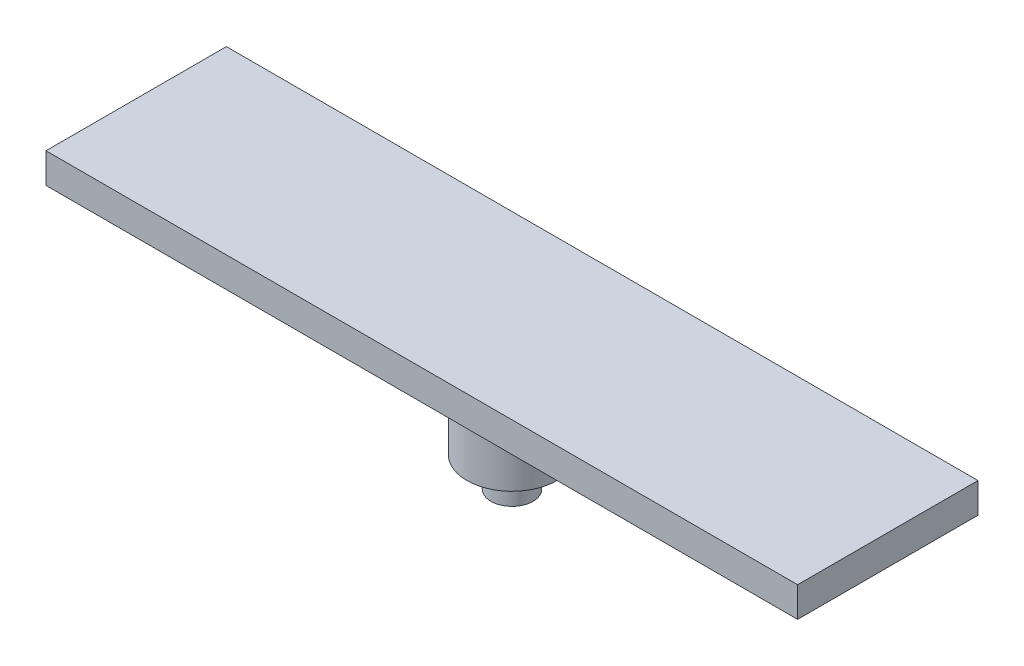
ISO-10303-21;
HEADER;
FILE_DESCRIPTION(('STEP AP214'),'2;1');
FILE_NAME('part.step','',(''),(''),'','','');
FILE_SCHEMA(('AUTOMOTIVE_DESIGN { 1 0 10303 214 1 1 1 1 }'));
ENDSEC;
DATA;
#1=APPLICATION_CONTEXT('core data for automotive mechanical design processes');
#2=APPLICATION_PROTOCOL_DEFINITION('international standard','automotive_design',2000,#1);
#3=PRODUCT_CONTEXT('',#1,'mechanical');
#4=PRODUCT('Part','Part','',(#3));
#5=PRODUCT_RELATED_PRODUCT_CATEGORY('part','',(#4));
#6=PRODUCT_DEFINITION_FORMATION('','',#4);
#7=PRODUCT_DEFINITION_CONTEXT('part definition',#1,'design');
#8=PRODUCT_DEFINITION('design','',#6,#7);
#9=PRODUCT_DEFINITION_SHAPE('','',#8);
#10=(LENGTH_UNIT() NAMED_UNIT(*) SI_UNIT(.MILLI.,.METRE.));
#11=(NAMED_UNIT(*) PLANE_ANGLE_UNIT() SI_UNIT($,.RADIAN.));
#12=(NAMED_UNIT(*) SI_UNIT($,.STERADIAN.) SOLID_ANGLE_UNIT());
#13=UNCERTAINTY_MEASURE_WITH_UNIT(LENGTH_MEASURE(1.E-05),#10,'distance_accuracy_value','');
#14=(GEOMETRIC_REPRESENTATION_CONTEXT(3) GLOBAL_UNCERTAINTY_ASSIGNED_CONTEXT((#13)) GLOBAL_UNIT_ASSIGNED_CONTEXT((#10,
#11,#12)) REPRESENTATION_CONTEXT('',''));
#15=CARTESIAN_POINT('',(0.,0.,0.));
#16=DIRECTION('',(0.,0.,1.));
#17=DIRECTION('',(1.,0.,0.));
#18=AXIS2_PLACEMENT_3D('',#15,#16,#17);
#19=CARTESIAN_POINT('',(0.,15.,0.));
#20=DIRECTION('',(0.,-1.,0.));
#21=DIRECTION('',(0.,0.,-1.));
#22=AXIS2_PLACEMENT_3D('',#19,#20,#21);
#23=CYLINDRICAL_SURFACE('',#22,7.5);
#24=CARTESIAN_POINT('',(0.,15.,0.));
#25=DIRECTION('',(0.,1.,0.));
#26=DIRECTION('',(0.,0.,1.));
#27=AXIS2_PLACEMENT_3D('',#24,#25,#26);
#28=CIRCLE('',#27,7.5);
#29=CARTESIAN_POINT('',(0.,15.,7.5));
#30=VERTEX_POINT('',#29);
#31=EDGE_CURVE('E55',#30,#30,#28,.T.);
#32=ORIENTED_EDGE('',*,*,#31,.F.);
#33=EDGE_LOOP('',(#32));
#34=FACE_BOUND('',#33,.T.);
#35=CARTESIAN_POINT('',(0.,0.,0.));
#36=DIRECTION('',(0.,1.,0.));
#37=DIRECTION('',(0.,0.,1.));
#38=AXIS2_PLACEMENT_3D('',#35,#36,#37);
#39=CIRCLE('',#38,7.5);
#40=CARTESIAN_POINT('',(0.,0.,7.5));
#41=VERTEX_POINT('',#40);
#42=EDGE_CURVE('E48',#41,#41,#39,.T.);
#43=ORIENTED_EDGE('',*,*,#42,.T.);
#44=EDGE_LOOP('',(#43));
#45=FACE_BOUND('',#44,.T.);
#46=ADVANCED_FACE('F45',(#34,#45),#23,.T.);
#47=CARTESIAN_POINT('',(0.,0.,0.));
#48=DIRECTION('',(0.,1.,0.));
#49=DIRECTION('',(0.,0.,1.));
#50=AXIS2_PLACEMENT_3D('',#47,#48,#49);
#51=PLANE('',#50);
#52=CARTESIAN_POINT('',(0.,0.,0.));
#53=DIRECTION('',(0.,-1.,0.));
#54=DIRECTION('',(0.,0.,-1.));
#55=AXIS2_PLACEMENT_3D('',#52,#53,#54);
#56=CIRCLE('',#55,3.5);
#57=CARTESIAN_POINT('',(0.,0.,-3.5));
#58=VERTEX_POINT('',#57);
#59=EDGE_CURVE('E11',#58,#58,#56,.T.);
#60=ORIENTED_EDGE('',*,*,#59,.F.);
#61=EDGE_LOOP('',(#60));
#62=FACE_BOUND('',#61,.T.);
#63=ORIENTED_EDGE('',*,*,#42,.F.);
#64=EDGE_LOOP('',(#63));
#65=FACE_BOUND('',#64,.T.);
#66=ADVANCED_FACE('F144',(#62,#65),#51,.F.);
#67=CARTESIAN_POINT('',(62.5,20.,15.));
#68=DIRECTION('',(-1.,0.,0.));
#69=DIRECTION('',(0.,0.,1.));
#70=AXIS2_PLACEMENT_3D('',#67,#68,#69);
#71=PLANE('',#70);
#72=DIRECTION('',(0.,0.,-1.));
#73=VECTOR('',#72,1.);
#74=CARTESIAN_POINT('',(62.5,15.,15.));
#75=LINE('',#74,#73);
#76=CARTESIAN_POINT('',(62.5,15.,15.));
#77=VERTEX_POINT('',#76);
#78=CARTESIAN_POINT('',(62.5,15.,-15.));
#79=VERTEX_POINT('',#78);
#80=EDGE_CURVE('E119',#77,#79,#75,.T.);
#81=ORIENTED_EDGE('',*,*,#80,.T.);
#82=DIRECTION('',(0.,-1.,0.));
#83=VECTOR('',#82,1.);
#84=CARTESIAN_POINT('',(62.5,20.,-15.));
#85=LINE('',#84,#83);
#86=CARTESIAN_POINT('',(62.5,20.,-15.));
#87=VERTEX_POINT('',#86);
#88=EDGE_CURVE('E108',#87,#79,#85,.T.);
#89=ORIENTED_EDGE('',*,*,#88,.F.);
#90=DIRECTION('',(0.,0.,-1.));
#91=VECTOR('',#90,1.);
#92=CARTESIAN_POINT('',(62.5,20.,15.));
#93=LINE('',#92,#91);
#94=CARTESIAN_POINT('',(62.5,20.,15.));
#95=VERTEX_POINT('',#94);
#96=EDGE_CURVE('E100',#95,#87,#93,.T.);
#97=ORIENTED_EDGE('',*,*,#96,.F.);
#98=DIRECTION('',(0.,-1.,0.));
#99=VECTOR('',#98,1.);
#100=CARTESIAN_POINT('',(62.5,20.,15.));
#101=LINE('',#100,#99);
#102=EDGE_CURVE('E115',#95,#77,#101,.T.);
#103=ORIENTED_EDGE('',*,*,#102,.T.);
#104=EDGE_LOOP('',(#81,#89,#97,#103));
#105=FACE_BOUND('',#104,.T.);
#106=ADVANCED_FACE('F146',(#105),#71,.F.);
#107=CARTESIAN_POINT('',(-62.5,20.,-15.));
#108=DIRECTION('',(0.,0.,1.));
#109=DIRECTION('',(1.,0.,0.));
#110=AXIS2_PLACEMENT_3D('',#107,#108,#109);
#111=PLANE('',#110);
#112=DIRECTION('',(-1.,0.,0.));
#113=VECTOR('',#112,1.);
#114=CARTESIAN_POINT('',(-62.5,15.,-15.));
#115=LINE('',#114,#113);
#116=CARTESIAN_POINT('',(-62.5,15.,-15.));
#117=VERTEX_POINT('',#116);
#118=EDGE_CURVE('E106',#79,#117,#115,.T.);
#119=ORIENTED_EDGE('',*,*,#118,.T.);
#120=DIRECTION('',(0.,-1.,0.));
#121=VECTOR('',#120,1.);
#122=CARTESIAN_POINT('',(-62.5,20.,-15.));
#123=LINE('',#122,#121);
#124=CARTESIAN_POINT('',(-62.5,20.,-15.));
#125=VERTEX_POINT('',#124);
#126=EDGE_CURVE('E104',#125,#117,#123,.T.);
#127=ORIENTED_EDGE('',*,*,#126,.F.);
#128=DIRECTION('',(-1.,0.,0.));
#129=VECTOR('',#128,1.);
#130=CARTESIAN_POINT('',(-62.5,20.,-15.));
#131=LINE('',#130,#129);
#132=EDGE_CURVE('E95',#87,#125,#131,.T.);
#133=ORIENTED_EDGE('',*,*,#132,.F.);
#134=ORIENTED_EDGE('',*,*,#88,.T.);
#135=EDGE_LOOP('',(#119,#127,#133,#134));
#136=FACE_BOUND('',#135,.T.);
#137=ADVANCED_FACE('F105',(#136),#111,.F.);
#138=CARTESIAN_POINT('',(-62.5,20.,15.));
#139=DIRECTION('',(1.,0.,0.));
#140=DIRECTION('',(0.,0.,-1.));
#141=AXIS2_PLACEMENT_3D('',#138,#139,#140);
#142=PLANE('',#141);
#143=DIRECTION('',(0.,0.,1.));
#144=VECTOR('',#143,1.);
#145=CARTESIAN_POINT('',(-62.5,15.,15.));
#146=LINE('',#145,#144);
#147=CARTESIAN_POINT('',(-62.5,15.,15.));
#148=VERTEX_POINT('',#147);
#149=EDGE_CURVE('E81',#117,#148,#146,.T.);
#150=ORIENTED_EDGE('',*,*,#149,.T.);
#151=DIRECTION('',(0.,-1.,0.));
#152=VECTOR('',#151,1.);
#153=CARTESIAN_POINT('',(-62.5,20.,15.));
#154=LINE('',#153,#152);
#155=CARTESIAN_POINT('',(-62.5,20.,15.));
#156=VERTEX_POINT('',#155);
#157=EDGE_CURVE('E109',#156,#148,#154,.T.);
#158=ORIENTED_EDGE('',*,*,#157,.F.);
#159=DIRECTION('',(0.,0.,1.));
#160=VECTOR('',#159,1.);
#161=CARTESIAN_POINT('',(-62.5,20.,15.));
#162=LINE('',#161,#160);
#163=EDGE_CURVE('E98',#125,#156,#162,.T.);
#164=ORIENTED_EDGE('',*,*,#163,.F.);
#165=ORIENTED_EDGE('',*,*,#126,.T.);
#166=EDGE_LOOP('',(#150,#158,#164,#165));
#167=FACE_BOUND('',#166,.T.);
#168=ADVANCED_FACE('F111',(#167),#142,.F.);
#169=CARTESIAN_POINT('',(-62.5,20.,15.));
#170=DIRECTION('',(0.,0.,-1.));
#171=DIRECTION('',(-1.,0.,0.));
#172=AXIS2_PLACEMENT_3D('',#169,#170,#171);
#173=PLANE('',#172);
#174=DIRECTION('',(1.,0.,0.));
#175=VECTOR('',#174,1.);
#176=CARTESIAN_POINT('',(-62.5,15.,15.));
#177=LINE('',#176,#175);
#178=EDGE_CURVE('E87',#148,#77,#177,.T.);
#179=ORIENTED_EDGE('',*,*,#178,.T.);
#180=ORIENTED_EDGE('',*,*,#102,.F.);
#181=DIRECTION('',(1.,0.,0.));
#182=VECTOR('',#181,1.);
#183=CARTESIAN_POINT('',(-62.5,20.,15.));
#184=LINE('',#183,#182);
#185=EDGE_CURVE('E64',#156,#95,#184,.T.);
#186=ORIENTED_EDGE('',*,*,#185,.F.);
#187=ORIENTED_EDGE('',*,*,#157,.T.);
#188=EDGE_LOOP('',(#179,#180,#186,#187));
#189=FACE_BOUND('',#188,.T.);
#190=ADVANCED_FACE('F163',(#189),#173,.F.);
#191=CARTESIAN_POINT('',(0.,20.,0.));
#192=DIRECTION('',(0.,-1.,0.));
#193=DIRECTION('',(0.,0.,-1.));
#194=AXIS2_PLACEMENT_3D('',#191,#192,#193);
#195=PLANE('',#194);
#196=ORIENTED_EDGE('',*,*,#96,.T.);
#197=ORIENTED_EDGE('',*,*,#132,.T.);
#198=ORIENTED_EDGE('',*,*,#163,.T.);
#199=ORIENTED_EDGE('',*,*,#185,.T.);
#200=EDGE_LOOP('',(#196,#197,#198,#199));
#201=FACE_BOUND('',#200,.T.);
#202=ADVANCED_FACE('F96',(#201),#195,.F.);
#203=CARTESIAN_POINT('',(0.,15.,0.));
#204=DIRECTION('',(0.,-1.,0.));
#205=DIRECTION('',(0.,0.,-1.));
#206=AXIS2_PLACEMENT_3D('',#203,#204,#205);
#207=PLANE('',#206);
#208=ORIENTED_EDGE('',*,*,#31,.T.);
#209=EDGE_LOOP('',(#208));
#210=FACE_BOUND('',#209,.T.);
#211=ORIENTED_EDGE('',*,*,#80,.F.);
#212=ORIENTED_EDGE('',*,*,#178,.F.);
#213=ORIENTED_EDGE('',*,*,#149,.F.);
#214=ORIENTED_EDGE('',*,*,#118,.F.);
#215=EDGE_LOOP('',(#211,#212,#213,#214));
#216=FACE_BOUND('',#215,.T.);
#217=ADVANCED_FACE('F166',(#210,#216),#207,.T.);
#218=CARTESIAN_POINT('',(0.,-5.,0.));
#219=DIRECTION('',(0.,1.,0.));
#220=DIRECTION('',(0.,0.,1.));
#221=AXIS2_PLACEMENT_3D('',#218,#219,#220);
#222=CYLINDRICAL_SURFACE('',#221,3.5);
#223=CARTESIAN_POINT('',(0.,-5.,0.));
#224=DIRECTION('',(0.,-1.,0.));
#225=DIRECTION('',(0.,0.,-1.));
#226=AXIS2_PLACEMENT_3D('',#223,#224,#225);
#227=CIRCLE('',#226,3.5);
#228=CARTESIAN_POINT('',(0.,-5.,-3.5));
#229=VERTEX_POINT('',#228);
#230=EDGE_CURVE('E123',#229,#229,#227,.T.);
#231=ORIENTED_EDGE('',*,*,#230,.F.);
#232=EDGE_LOOP('',(#231));
#233=FACE_BOUND('',#232,.T.);
#234=ORIENTED_EDGE('',*,*,#59,.T.);
#235=EDGE_LOOP('',(#234));
#236=FACE_BOUND('',#235,.T.);
#237=ADVANCED_FACE('F168',(#233,#236),#222,.T.);
#238=CARTESIAN_POINT('',(0.,-5.,0.));
#239=DIRECTION('',(0.,-1.,0.));
#240=DIRECTION('',(0.,0.,-1.));
#241=AXIS2_PLACEMENT_3D('',#238,#239,#240);
#242=PLANE('',#241);
#243=ORIENTED_EDGE('',*,*,#230,.T.);
#244=EDGE_LOOP('',(#243));
#245=FACE_BOUND('',#244,.T.);
#246=ADVANCED_FACE('F172',(#245),#242,.T.);
#247=CLOSED_SHELL('',(#46,#66,#106,#137,#168,#190,#202,#217,#237,#246));
#248=MANIFOLD_SOLID_BREP('B2',#247);
#249=ADVANCED_BREP_SHAPE_REPRESENTATION('',(#18,#248),#14);
#250=SHAPE_DEFINITION_REPRESENTATION(#9,#249);
ENDSEC;
END-ISO-10303-21;
